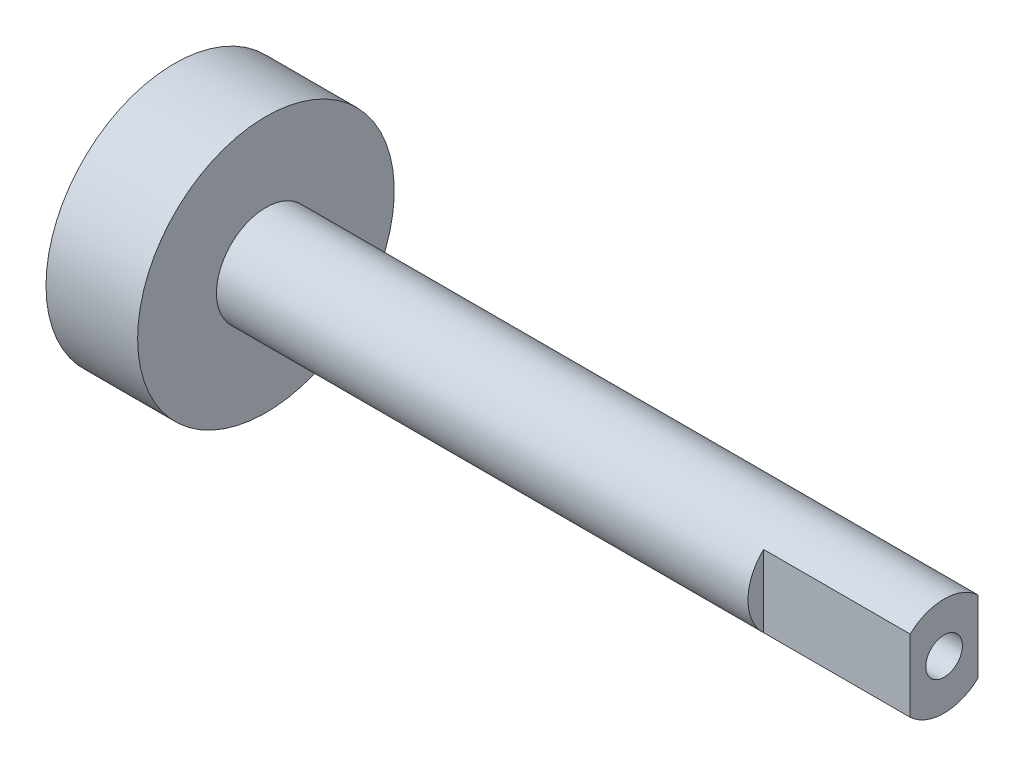
ISO-10303-21;
HEADER;
FILE_DESCRIPTION(('STEP AP214'),'2;1');
FILE_NAME('part.step','',(''),(''),'','','');
FILE_SCHEMA(('AUTOMOTIVE_DESIGN { 1 0 10303 214 1 1 1 1 }'));
ENDSEC;
DATA;
#1=APPLICATION_CONTEXT('core data for automotive mechanical design processes');
#2=APPLICATION_PROTOCOL_DEFINITION('international standard','automotive_design',2000,#1);
#3=PRODUCT_CONTEXT('',#1,'mechanical');
#4=PRODUCT('Part','Part','',(#3));
#5=PRODUCT_RELATED_PRODUCT_CATEGORY('part','',(#4));
#6=PRODUCT_DEFINITION_FORMATION('','',#4);
#7=PRODUCT_DEFINITION_CONTEXT('part definition',#1,'design');
#8=PRODUCT_DEFINITION('design','',#6,#7);
#9=PRODUCT_DEFINITION_SHAPE('','',#8);
#10=(LENGTH_UNIT() NAMED_UNIT(*) SI_UNIT(.MILLI.,.METRE.));
#11=(NAMED_UNIT(*) PLANE_ANGLE_UNIT() SI_UNIT($,.RADIAN.));
#12=(NAMED_UNIT(*) SI_UNIT($,.STERADIAN.) SOLID_ANGLE_UNIT());
#13=UNCERTAINTY_MEASURE_WITH_UNIT(LENGTH_MEASURE(1.E-05),#10,'distance_accuracy_value','');
#14=(GEOMETRIC_REPRESENTATION_CONTEXT(3) GLOBAL_UNCERTAINTY_ASSIGNED_CONTEXT((#13)) GLOBAL_UNIT_ASSIGNED_CONTEXT((#10,
#11,#12)) REPRESENTATION_CONTEXT('',''));
#15=CARTESIAN_POINT('',(0.,0.,0.));
#16=DIRECTION('',(0.,0.,1.));
#17=DIRECTION('',(1.,0.,0.));
#18=AXIS2_PLACEMENT_3D('',#15,#16,#17);
#19=CARTESIAN_POINT('',(18.5,0.,0.));
#20=DIRECTION('',(-1.,0.,0.));
#21=DIRECTION('',(0.,0.,1.));
#22=AXIS2_PLACEMENT_3D('',#19,#20,#21);
#23=CYLINDRICAL_SURFACE('',#22,2.7);
#24=CARTESIAN_POINT('',(18.5,0.,0.));
#25=DIRECTION('',(1.,0.,0.));
#26=DIRECTION('',(0.,0.,-1.));
#27=AXIS2_PLACEMENT_3D('',#24,#25,#26);
#28=CIRCLE('',#27,2.7);
#29=CARTESIAN_POINT('',(18.5,-1.96659604392971,1.85));
#30=VERTEX_POINT('',#29);
#31=CARTESIAN_POINT('',(18.5,-1.96659604392971,-1.85));
#32=VERTEX_POINT('',#31);
#33=EDGE_CURVE('E54',#30,#32,#28,.T.);
#34=ORIENTED_EDGE('',*,*,#33,.F.);
#35=DIRECTION('',(1.,0.,0.));
#36=VECTOR('',#35,1.);
#37=CARTESIAN_POINT('',(10.5,-1.96659604392971,1.85));
#38=LINE('',#37,#36);
#39=CARTESIAN_POINT('',(10.5,-1.96659604392971,1.85));
#40=VERTEX_POINT('',#39);
#41=EDGE_CURVE('E61',#40,#30,#38,.T.);
#42=ORIENTED_EDGE('',*,*,#41,.F.);
#43=CARTESIAN_POINT('',(10.5,0.,0.));
#44=DIRECTION('',(1.,0.,0.));
#45=DIRECTION('',(0.,0.,-1.));
#46=AXIS2_PLACEMENT_3D('',#43,#44,#45);
#47=CIRCLE('',#46,2.7);
#48=CARTESIAN_POINT('',(10.5,1.96659604392971,1.85));
#49=VERTEX_POINT('',#48);
#50=EDGE_CURVE('E89',#49,#40,#47,.T.);
#51=ORIENTED_EDGE('',*,*,#50,.F.);
#52=DIRECTION('',(1.,0.,0.));
#53=VECTOR('',#52,1.);
#54=CARTESIAN_POINT('',(10.5,1.96659604392971,1.85));
#55=LINE('',#54,#53);
#56=CARTESIAN_POINT('',(18.5,1.96659604392971,1.85));
#57=VERTEX_POINT('',#56);
#58=EDGE_CURVE('E98',#49,#57,#55,.T.);
#59=ORIENTED_EDGE('',*,*,#58,.T.);
#60=CARTESIAN_POINT('',(18.5,1.96659604392971,-1.85));
#61=VERTEX_POINT('',#60);
#62=EDGE_CURVE('E11',#61,#57,#28,.T.);
#63=ORIENTED_EDGE('',*,*,#62,.F.);
#64=DIRECTION('',(1.,0.,0.));
#65=VECTOR('',#64,1.);
#66=CARTESIAN_POINT('',(10.5,1.96659604392971,-1.85));
#67=LINE('',#66,#65);
#68=CARTESIAN_POINT('',(10.5,1.96659604392971,-1.85));
#69=VERTEX_POINT('',#68);
#70=EDGE_CURVE('E69',#69,#61,#67,.T.);
#71=ORIENTED_EDGE('',*,*,#70,.F.);
#72=CARTESIAN_POINT('',(10.5,0.,0.));
#73=DIRECTION('',(1.,0.,0.));
#74=DIRECTION('',(0.,0.,-1.));
#75=AXIS2_PLACEMENT_3D('',#72,#73,#74);
#76=CIRCLE('',#75,2.7);
#77=CARTESIAN_POINT('',(10.5,-1.96659604392971,-1.85));
#78=VERTEX_POINT('',#77);
#79=EDGE_CURVE('E111',#78,#69,#76,.T.);
#80=ORIENTED_EDGE('',*,*,#79,.F.);
#81=DIRECTION('',(1.,0.,0.));
#82=VECTOR('',#81,1.);
#83=CARTESIAN_POINT('',(10.5,-1.96659604392971,-1.85));
#84=LINE('',#83,#82);
#85=EDGE_CURVE('E122',#78,#32,#84,.T.);
#86=ORIENTED_EDGE('',*,*,#85,.T.);
#87=EDGE_LOOP('',(#34,#42,#51,#59,#63,#71,#80,#86));
#88=FACE_BOUND('',#87,.T.);
#89=CARTESIAN_POINT('',(-18.5,0.,0.));
#90=DIRECTION('',(1.,0.,0.));
#91=DIRECTION('',(0.,0.,-1.));
#92=AXIS2_PLACEMENT_3D('',#89,#90,#91);
#93=CIRCLE('',#92,2.7);
#94=CARTESIAN_POINT('',(-18.5,0.,-2.7));
#95=VERTEX_POINT('',#94);
#96=EDGE_CURVE('E48',#95,#95,#93,.T.);
#97=ORIENTED_EDGE('',*,*,#96,.T.);
#98=EDGE_LOOP('',(#97));
#99=FACE_BOUND('',#98,.T.);
#100=ADVANCED_FACE('F45',(#88,#99),#23,.T.);
#101=CARTESIAN_POINT('',(18.5,0.,0.));
#102=DIRECTION('',(1.,0.,0.));
#103=DIRECTION('',(0.,0.,-1.));
#104=AXIS2_PLACEMENT_3D('',#101,#102,#103);
#105=PLANE('',#104);
#106=CARTESIAN_POINT('',(18.5,0.,0.));
#107=DIRECTION('',(1.,0.,0.));
#108=DIRECTION('',(0.,0.,-1.));
#109=AXIS2_PLACEMENT_3D('',#106,#107,#108);
#110=CIRCLE('',#109,1.);
#111=CARTESIAN_POINT('',(18.5,0.,-1.));
#112=VERTEX_POINT('',#111);
#113=EDGE_CURVE('E130',#112,#112,#110,.T.);
#114=ORIENTED_EDGE('',*,*,#113,.F.);
#115=EDGE_LOOP('',(#114));
#116=FACE_BOUND('',#115,.T.);
#117=DIRECTION('',(0.,1.,0.));
#118=VECTOR('',#117,1.);
#119=CARTESIAN_POINT('',(18.5,1.96659604392971,1.85));
#120=LINE('',#119,#118);
#121=EDGE_CURVE('E95',#30,#57,#120,.T.);
#122=ORIENTED_EDGE('',*,*,#121,.F.);
#123=ORIENTED_EDGE('',*,*,#33,.T.);
#124=DIRECTION('',(0.,-1.,0.));
#125=VECTOR('',#124,1.);
#126=CARTESIAN_POINT('',(18.5,1.96659604392971,-1.85));
#127=LINE('',#126,#125);
#128=EDGE_CURVE('E115',#61,#32,#127,.T.);
#129=ORIENTED_EDGE('',*,*,#128,.F.);
#130=ORIENTED_EDGE('',*,*,#62,.T.);
#131=EDGE_LOOP('',(#122,#123,#129,#130));
#132=FACE_BOUND('',#131,.T.);
#133=ADVANCED_FACE('F148',(#116,#132),#105,.T.);
#134=CARTESIAN_POINT('',(10.5,1.96659604392971,-1.85));
#135=DIRECTION('',(0.,0.,1.));
#136=DIRECTION('',(1.,0.,0.));
#137=AXIS2_PLACEMENT_3D('',#134,#135,#136);
#138=PLANE('',#137);
#139=ORIENTED_EDGE('',*,*,#128,.T.);
#140=ORIENTED_EDGE('',*,*,#85,.F.);
#141=DIRECTION('',(0.,-1.,0.));
#142=VECTOR('',#141,1.);
#143=CARTESIAN_POINT('',(10.5,1.96659604392971,-1.85));
#144=LINE('',#143,#142);
#145=EDGE_CURVE('E114',#69,#78,#144,.T.);
#146=ORIENTED_EDGE('',*,*,#145,.F.);
#147=ORIENTED_EDGE('',*,*,#70,.T.);
#148=EDGE_LOOP('',(#139,#140,#146,#147));
#149=FACE_BOUND('',#148,.T.);
#150=ADVANCED_FACE('F149',(#149),#138,.F.);
#151=CARTESIAN_POINT('',(10.5,0.,0.));
#152=DIRECTION('',(1.,0.,0.));
#153=DIRECTION('',(0.,0.,-1.));
#154=AXIS2_PLACEMENT_3D('',#151,#152,#153);
#155=PLANE('',#154);
#156=ORIENTED_EDGE('',*,*,#79,.T.);
#157=ORIENTED_EDGE('',*,*,#145,.T.);
#158=EDGE_LOOP('',(#156,#157));
#159=FACE_BOUND('',#158,.T.);
#160=ADVANCED_FACE('F152',(#159),#155,.T.);
#161=CARTESIAN_POINT('',(10.5,1.96659604392971,1.85));
#162=DIRECTION('',(0.,0.,-1.));
#163=DIRECTION('',(-1.,0.,0.));
#164=AXIS2_PLACEMENT_3D('',#161,#162,#163);
#165=PLANE('',#164);
#166=ORIENTED_EDGE('',*,*,#121,.T.);
#167=ORIENTED_EDGE('',*,*,#58,.F.);
#168=DIRECTION('',(0.,1.,0.));
#169=VECTOR('',#168,1.);
#170=CARTESIAN_POINT('',(10.5,1.96659604392971,1.85));
#171=LINE('',#170,#169);
#172=EDGE_CURVE('E91',#40,#49,#171,.T.);
#173=ORIENTED_EDGE('',*,*,#172,.F.);
#174=ORIENTED_EDGE('',*,*,#41,.T.);
#175=EDGE_LOOP('',(#166,#167,#173,#174));
#176=FACE_BOUND('',#175,.T.);
#177=ADVANCED_FACE('F97',(#176),#165,.F.);
#178=CARTESIAN_POINT('',(10.5,0.,0.));
#179=DIRECTION('',(1.,0.,0.));
#180=DIRECTION('',(0.,0.,-1.));
#181=AXIS2_PLACEMENT_3D('',#178,#179,#180);
#182=PLANE('',#181);
#183=ORIENTED_EDGE('',*,*,#50,.T.);
#184=ORIENTED_EDGE('',*,*,#172,.T.);
#185=EDGE_LOOP('',(#183,#184));
#186=FACE_BOUND('',#185,.T.);
#187=ADVANCED_FACE('F90',(#186),#182,.T.);
#188=CARTESIAN_POINT('',(12.5,0.,0.));
#189=DIRECTION('',(1.,0.,0.));
#190=DIRECTION('',(0.,0.,-1.));
#191=AXIS2_PLACEMENT_3D('',#188,#189,#190);
#192=CYLINDRICAL_SURFACE('',#191,1.);
#193=CARTESIAN_POINT('',(12.5,0.,0.));
#194=DIRECTION('',(1.,0.,0.));
#195=DIRECTION('',(0.,0.,-1.));
#196=AXIS2_PLACEMENT_3D('',#193,#194,#195);
#197=CIRCLE('',#196,1.);
#198=CARTESIAN_POINT('',(12.5,0.,-1.));
#199=VERTEX_POINT('',#198);
#200=EDGE_CURVE('E121',#199,#199,#197,.T.);
#201=ORIENTED_EDGE('',*,*,#200,.F.);
#202=EDGE_LOOP('',(#201));
#203=FACE_BOUND('',#202,.T.);
#204=ORIENTED_EDGE('',*,*,#113,.T.);
#205=EDGE_LOOP('',(#204));
#206=FACE_BOUND('',#205,.T.);
#207=ADVANCED_FACE('F170',(#203,#206),#192,.F.);
#208=CARTESIAN_POINT('',(12.5,0.,0.));
#209=DIRECTION('',(1.,0.,0.));
#210=DIRECTION('',(0.,0.,-1.));
#211=AXIS2_PLACEMENT_3D('',#208,#209,#210);
#212=PLANE('',#211);
#213=ORIENTED_EDGE('',*,*,#200,.T.);
#214=EDGE_LOOP('',(#213));
#215=FACE_BOUND('',#214,.T.);
#216=ADVANCED_FACE('F172',(#215),#212,.T.);
#217=CARTESIAN_POINT('',(-23.5,0.,0.));
#218=DIRECTION('',(1.,0.,0.));
#219=DIRECTION('',(0.,0.,-1.));
#220=AXIS2_PLACEMENT_3D('',#217,#218,#219);
#221=CYLINDRICAL_SURFACE('',#220,7.);
#222=CARTESIAN_POINT('',(-23.5,0.,0.));
#223=DIRECTION('',(-1.,0.,0.));
#224=DIRECTION('',(0.,0.,1.));
#225=AXIS2_PLACEMENT_3D('',#222,#223,#224);
#226=CIRCLE('',#225,7.);
#227=CARTESIAN_POINT('',(-23.5,0.,7.));
#228=VERTEX_POINT('',#227);
#229=EDGE_CURVE('E137',#228,#228,#226,.T.);
#230=ORIENTED_EDGE('',*,*,#229,.F.);
#231=EDGE_LOOP('',(#230));
#232=FACE_BOUND('',#231,.T.);
#233=CARTESIAN_POINT('',(-18.5,0.,0.));
#234=DIRECTION('',(-1.,0.,0.));
#235=DIRECTION('',(0.,0.,1.));
#236=AXIS2_PLACEMENT_3D('',#233,#234,#235);
#237=CIRCLE('',#236,7.);
#238=CARTESIAN_POINT('',(-18.5,0.,7.));
#239=VERTEX_POINT('',#238);
#240=EDGE_CURVE('E140',#239,#239,#237,.T.);
#241=ORIENTED_EDGE('',*,*,#240,.T.);
#242=EDGE_LOOP('',(#241));
#243=FACE_BOUND('',#242,.T.);
#244=ADVANCED_FACE('F179',(#232,#243),#221,.T.);
#245=CARTESIAN_POINT('',(-23.5,0.,0.));
#246=DIRECTION('',(-1.,0.,0.));
#247=DIRECTION('',(0.,0.,1.));
#248=AXIS2_PLACEMENT_3D('',#245,#246,#247);
#249=PLANE('',#248);
#250=ORIENTED_EDGE('',*,*,#229,.T.);
#251=EDGE_LOOP('',(#250));
#252=FACE_BOUND('',#251,.T.);
#253=ADVANCED_FACE('F187',(#252),#249,.T.);
#254=CARTESIAN_POINT('',(-18.5,0.,0.));
#255=DIRECTION('',(-1.,0.,0.));
#256=DIRECTION('',(0.,0.,1.));
#257=AXIS2_PLACEMENT_3D('',#254,#255,#256);
#258=PLANE('',#257);
#259=ORIENTED_EDGE('',*,*,#96,.F.);
#260=EDGE_LOOP('',(#259));
#261=FACE_BOUND('',#260,.T.);
#262=ORIENTED_EDGE('',*,*,#240,.F.);
#263=EDGE_LOOP('',(#262));
#264=FACE_BOUND('',#263,.T.);
#265=ADVANCED_FACE('F189',(#261,#264),#258,.F.);
#266=CLOSED_SHELL('',(#100,#133,#150,#160,#177,#187,#207,#216,#244,#253,#265));
#267=MANIFOLD_SOLID_BREP('B2',#266);
#268=ADVANCED_BREP_SHAPE_REPRESENTATION('',(#18,#267),#14);
#269=SHAPE_DEFINITION_REPRESENTATION(#9,#268);
ENDSEC;
END-ISO-10303-21;
